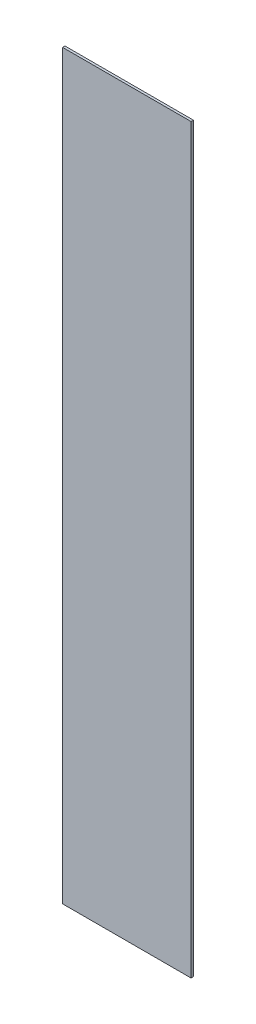
ISO-10303-21;
HEADER;
FILE_DESCRIPTION(('STEP AP214'),'2;1');
FILE_NAME('part.step','',(''),(''),'','','');
FILE_SCHEMA(('AUTOMOTIVE_DESIGN { 1 0 10303 214 1 1 1 1 }'));
ENDSEC;
DATA;
#1=APPLICATION_CONTEXT('core data for automotive mechanical design processes');
#2=APPLICATION_PROTOCOL_DEFINITION('international standard','automotive_design',2000,#1);
#3=PRODUCT_CONTEXT('',#1,'mechanical');
#4=PRODUCT('Part','Part','',(#3));
#5=PRODUCT_RELATED_PRODUCT_CATEGORY('part','',(#4));
#6=PRODUCT_DEFINITION_FORMATION('','',#4);
#7=PRODUCT_DEFINITION_CONTEXT('part definition',#1,'design');
#8=PRODUCT_DEFINITION('design','',#6,#7);
#9=PRODUCT_DEFINITION_SHAPE('','',#8);
#10=(LENGTH_UNIT() NAMED_UNIT(*) SI_UNIT(.MILLI.,.METRE.));
#11=(NAMED_UNIT(*) PLANE_ANGLE_UNIT() SI_UNIT($,.RADIAN.));
#12=(NAMED_UNIT(*) SI_UNIT($,.STERADIAN.) SOLID_ANGLE_UNIT());
#13=UNCERTAINTY_MEASURE_WITH_UNIT(LENGTH_MEASURE(1.E-05),#10,'distance_accuracy_value','');
#14=(GEOMETRIC_REPRESENTATION_CONTEXT(3) GLOBAL_UNCERTAINTY_ASSIGNED_CONTEXT((#13)) GLOBAL_UNIT_ASSIGNED_CONTEXT((#10,
#11,#12)) REPRESENTATION_CONTEXT('',''));
#15=CARTESIAN_POINT('',(0.,0.,0.));
#16=DIRECTION('',(0.,0.,1.));
#17=DIRECTION('',(1.,0.,0.));
#18=AXIS2_PLACEMENT_3D('',#15,#16,#17);
#19=CARTESIAN_POINT('',(135.,780.,5.));
#20=DIRECTION('',(-1.,0.,0.));
#21=DIRECTION('',(0.,-1.,0.));
#22=AXIS2_PLACEMENT_3D('',#19,#20,#21);
#23=PLANE('',#22);
#24=DIRECTION('',(0.,1.,0.));
#25=VECTOR('',#24,1.);
#26=CARTESIAN_POINT('',(135.,780.,0.));
#27=LINE('',#26,#25);
#28=CARTESIAN_POINT('',(135.,-780.,0.));
#29=VERTEX_POINT('',#28);
#30=CARTESIAN_POINT('',(135.,780.,0.));
#31=VERTEX_POINT('',#30);
#32=EDGE_CURVE('E95',#29,#31,#27,.T.);
#33=ORIENTED_EDGE('',*,*,#32,.T.);
#34=DIRECTION('',(0.,0.,-1.));
#35=VECTOR('',#34,1.);
#36=CARTESIAN_POINT('',(135.,780.,5.));
#37=LINE('',#36,#35);
#38=CARTESIAN_POINT('',(135.,780.,5.));
#39=VERTEX_POINT('',#38);
#40=EDGE_CURVE('E11',#39,#31,#37,.T.);
#41=ORIENTED_EDGE('',*,*,#40,.F.);
#42=DIRECTION('',(0.,1.,0.));
#43=VECTOR('',#42,1.);
#44=CARTESIAN_POINT('',(135.,780.,5.));
#45=LINE('',#44,#43);
#46=CARTESIAN_POINT('',(135.,-780.,5.));
#47=VERTEX_POINT('',#46);
#48=EDGE_CURVE('E83',#47,#39,#45,.T.);
#49=ORIENTED_EDGE('',*,*,#48,.F.);
#50=DIRECTION('',(0.,0.,-1.));
#51=VECTOR('',#50,1.);
#52=CARTESIAN_POINT('',(135.,-780.,5.));
#53=LINE('',#52,#51);
#54=EDGE_CURVE('E91',#47,#29,#53,.T.);
#55=ORIENTED_EDGE('',*,*,#54,.T.);
#56=EDGE_LOOP('',(#33,#41,#49,#55));
#57=FACE_BOUND('',#56,.T.);
#58=ADVANCED_FACE('F32',(#57),#23,.F.);
#59=CARTESIAN_POINT('',(-135.,780.,5.));
#60=DIRECTION('',(0.,-1.,0.));
#61=DIRECTION('',(1.,0.,0.));
#62=AXIS2_PLACEMENT_3D('',#59,#60,#61);
#63=PLANE('',#62);
#64=DIRECTION('',(-1.,0.,0.));
#65=VECTOR('',#64,1.);
#66=CARTESIAN_POINT('',(-135.,780.,0.));
#67=LINE('',#66,#65);
#68=CARTESIAN_POINT('',(-135.,780.,0.));
#69=VERTEX_POINT('',#68);
#70=EDGE_CURVE('E87',#31,#69,#67,.T.);
#71=ORIENTED_EDGE('',*,*,#70,.T.);
#72=DIRECTION('',(0.,0.,-1.));
#73=VECTOR('',#72,1.);
#74=CARTESIAN_POINT('',(-135.,780.,5.));
#75=LINE('',#74,#73);
#76=CARTESIAN_POINT('',(-135.,780.,5.));
#77=VERTEX_POINT('',#76);
#78=EDGE_CURVE('E40',#77,#69,#75,.T.);
#79=ORIENTED_EDGE('',*,*,#78,.F.);
#80=DIRECTION('',(-1.,0.,0.));
#81=VECTOR('',#80,1.);
#82=CARTESIAN_POINT('',(-135.,780.,5.));
#83=LINE('',#82,#81);
#84=EDGE_CURVE('E78',#39,#77,#83,.T.);
#85=ORIENTED_EDGE('',*,*,#84,.F.);
#86=ORIENTED_EDGE('',*,*,#40,.T.);
#87=EDGE_LOOP('',(#71,#79,#85,#86));
#88=FACE_BOUND('',#87,.T.);
#89=ADVANCED_FACE('F86',(#88),#63,.F.);
#90=CARTESIAN_POINT('',(-135.,780.,5.));
#91=DIRECTION('',(1.,0.,0.));
#92=DIRECTION('',(0.,1.,0.));
#93=AXIS2_PLACEMENT_3D('',#90,#91,#92);
#94=PLANE('',#93);
#95=DIRECTION('',(0.,-1.,0.));
#96=VECTOR('',#95,1.);
#97=CARTESIAN_POINT('',(-135.,780.,0.));
#98=LINE('',#97,#96);
#99=CARTESIAN_POINT('',(-135.,-780.,0.));
#100=VERTEX_POINT('',#99);
#101=EDGE_CURVE('E65',#69,#100,#98,.T.);
#102=ORIENTED_EDGE('',*,*,#101,.T.);
#103=DIRECTION('',(0.,0.,-1.));
#104=VECTOR('',#103,1.);
#105=CARTESIAN_POINT('',(-135.,-780.,5.));
#106=LINE('',#105,#104);
#107=CARTESIAN_POINT('',(-135.,-780.,5.));
#108=VERTEX_POINT('',#107);
#109=EDGE_CURVE('E88',#108,#100,#106,.T.);
#110=ORIENTED_EDGE('',*,*,#109,.F.);
#111=DIRECTION('',(0.,-1.,0.));
#112=VECTOR('',#111,1.);
#113=CARTESIAN_POINT('',(-135.,780.,5.));
#114=LINE('',#113,#112);
#115=EDGE_CURVE('E81',#77,#108,#114,.T.);
#116=ORIENTED_EDGE('',*,*,#115,.F.);
#117=ORIENTED_EDGE('',*,*,#78,.T.);
#118=EDGE_LOOP('',(#102,#110,#116,#117));
#119=FACE_BOUND('',#118,.T.);
#120=ADVANCED_FACE('F89',(#119),#94,.F.);
#121=CARTESIAN_POINT('',(-135.,-780.,5.));
#122=DIRECTION('',(0.,1.,0.));
#123=DIRECTION('',(0.,0.,1.));
#124=AXIS2_PLACEMENT_3D('',#121,#122,#123);
#125=PLANE('',#124);
#126=DIRECTION('',(1.,0.,0.));
#127=VECTOR('',#126,1.);
#128=CARTESIAN_POINT('',(-135.,-780.,0.));
#129=LINE('',#128,#127);
#130=EDGE_CURVE('E71',#100,#29,#129,.T.);
#131=ORIENTED_EDGE('',*,*,#130,.T.);
#132=ORIENTED_EDGE('',*,*,#54,.F.);
#133=DIRECTION('',(1.,0.,0.));
#134=VECTOR('',#133,1.);
#135=CARTESIAN_POINT('',(-135.,-780.,5.));
#136=LINE('',#135,#134);
#137=EDGE_CURVE('E48',#108,#47,#136,.T.);
#138=ORIENTED_EDGE('',*,*,#137,.F.);
#139=ORIENTED_EDGE('',*,*,#109,.T.);
#140=EDGE_LOOP('',(#131,#132,#138,#139));
#141=FACE_BOUND('',#140,.T.);
#142=ADVANCED_FACE('F102',(#141),#125,.F.);
#143=CARTESIAN_POINT('',(0.,0.,5.));
#144=DIRECTION('',(0.,0.,1.));
#145=DIRECTION('',(1.,0.,0.));
#146=AXIS2_PLACEMENT_3D('',#143,#144,#145);
#147=PLANE('',#146);
#148=ORIENTED_EDGE('',*,*,#48,.T.);
#149=ORIENTED_EDGE('',*,*,#84,.T.);
#150=ORIENTED_EDGE('',*,*,#115,.T.);
#151=ORIENTED_EDGE('',*,*,#137,.T.);
#152=EDGE_LOOP('',(#148,#149,#150,#151));
#153=FACE_BOUND('',#152,.T.);
#154=ADVANCED_FACE('F79',(#153),#147,.T.);
#155=CARTESIAN_POINT('',(0.,0.,0.));
#156=DIRECTION('',(0.,0.,1.));
#157=DIRECTION('',(1.,0.,0.));
#158=AXIS2_PLACEMENT_3D('',#155,#156,#157);
#159=PLANE('',#158);
#160=ORIENTED_EDGE('',*,*,#32,.F.);
#161=ORIENTED_EDGE('',*,*,#130,.F.);
#162=ORIENTED_EDGE('',*,*,#101,.F.);
#163=ORIENTED_EDGE('',*,*,#70,.F.);
#164=EDGE_LOOP('',(#160,#161,#162,#163));
#165=FACE_BOUND('',#164,.T.);
#166=ADVANCED_FACE('F105',(#165),#159,.F.);
#167=CLOSED_SHELL('',(#58,#89,#120,#142,#154,#166));
#168=MANIFOLD_SOLID_BREP('B2',#167);
#169=ADVANCED_BREP_SHAPE_REPRESENTATION('',(#18,#168),#14);
#170=SHAPE_DEFINITION_REPRESENTATION(#9,#169);
ENDSEC;
END-ISO-10303-21;
